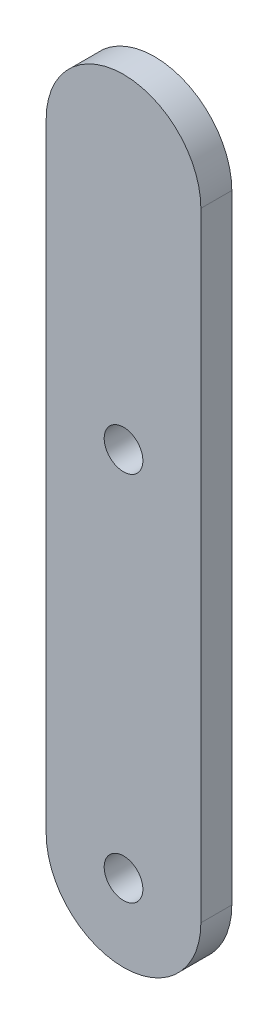
ISO-10303-21;
HEADER;
FILE_DESCRIPTION(('STEP AP214'),'2;1');
FILE_NAME('part.step','',(''),(''),'','','');
FILE_SCHEMA(('AUTOMOTIVE_DESIGN { 1 0 10303 214 1 1 1 1 }'));
ENDSEC;
DATA;
#1=APPLICATION_CONTEXT('core data for automotive mechanical design processes');
#2=APPLICATION_PROTOCOL_DEFINITION('international standard','automotive_design',2000,#1);
#3=PRODUCT_CONTEXT('',#1,'mechanical');
#4=PRODUCT('Part','Part','',(#3));
#5=PRODUCT_RELATED_PRODUCT_CATEGORY('part','',(#4));
#6=PRODUCT_DEFINITION_FORMATION('','',#4);
#7=PRODUCT_DEFINITION_CONTEXT('part definition',#1,'design');
#8=PRODUCT_DEFINITION('design','',#6,#7);
#9=PRODUCT_DEFINITION_SHAPE('','',#8);
#10=(LENGTH_UNIT() NAMED_UNIT(*) SI_UNIT(.MILLI.,.METRE.));
#11=(NAMED_UNIT(*) PLANE_ANGLE_UNIT() SI_UNIT($,.RADIAN.));
#12=(NAMED_UNIT(*) SI_UNIT($,.STERADIAN.) SOLID_ANGLE_UNIT());
#13=UNCERTAINTY_MEASURE_WITH_UNIT(LENGTH_MEASURE(1.E-05),#10,'distance_accuracy_value','');
#14=(GEOMETRIC_REPRESENTATION_CONTEXT(3) GLOBAL_UNCERTAINTY_ASSIGNED_CONTEXT((#13)) GLOBAL_UNIT_ASSIGNED_CONTEXT((#10,
#11,#12)) REPRESENTATION_CONTEXT('',''));
#15=CARTESIAN_POINT('',(0.,0.,0.));
#16=DIRECTION('',(0.,0.,1.));
#17=DIRECTION('',(1.,0.,0.));
#18=AXIS2_PLACEMENT_3D('',#15,#16,#17);
#19=CARTESIAN_POINT('',(0.,0.,2.));
#20=DIRECTION('',(0.,0.,1.));
#21=DIRECTION('',(1.,0.,0.));
#22=AXIS2_PLACEMENT_3D('',#19,#20,#21);
#23=PLANE('',#22);
#24=CARTESIAN_POINT('',(0.,0.,2.));
#25=DIRECTION('',(0.,0.,1.));
#26=DIRECTION('',(1.,0.,0.));
#27=AXIS2_PLACEMENT_3D('',#24,#25,#26);
#28=CIRCLE('',#27,1.25);
#29=CARTESIAN_POINT('',(1.25,0.,2.));
#30=VERTEX_POINT('',#29);
#31=EDGE_CURVE('E104',#30,#30,#28,.T.);
#32=ORIENTED_EDGE('',*,*,#31,.F.);
#33=EDGE_LOOP('',(#32));
#34=FACE_BOUND('',#33,.T.);
#35=CARTESIAN_POINT('',(0.,0.,2.));
#36=DIRECTION('',(0.,0.,1.));
#37=DIRECTION('',(1.,0.,0.));
#38=AXIS2_PLACEMENT_3D('',#35,#36,#37);
#39=CIRCLE('',#38,5.);
#40=CARTESIAN_POINT('',(-5.,0.,2.));
#41=VERTEX_POINT('',#40);
#42=CARTESIAN_POINT('',(5.,0.,2.));
#43=VERTEX_POINT('',#42);
#44=EDGE_CURVE('E89',#41,#43,#39,.T.);
#45=ORIENTED_EDGE('',*,*,#44,.T.);
#46=DIRECTION('',(0.,1.,0.));
#47=VECTOR('',#46,1.);
#48=CARTESIAN_POINT('',(5.,0.,2.));
#49=LINE('',#48,#47);
#50=CARTESIAN_POINT('',(5.,40.,2.));
#51=VERTEX_POINT('',#50);
#52=EDGE_CURVE('E84',#43,#51,#49,.T.);
#53=ORIENTED_EDGE('',*,*,#52,.T.);
#54=CARTESIAN_POINT('',(0.,40.,2.));
#55=DIRECTION('',(0.,0.,1.));
#56=DIRECTION('',(1.,0.,0.));
#57=AXIS2_PLACEMENT_3D('',#54,#55,#56);
#58=CIRCLE('',#57,5.);
#59=CARTESIAN_POINT('',(-5.,40.,2.));
#60=VERTEX_POINT('',#59);
#61=EDGE_CURVE('E87',#51,#60,#58,.T.);
#62=ORIENTED_EDGE('',*,*,#61,.T.);
#63=DIRECTION('',(0.,-1.,0.));
#64=VECTOR('',#63,1.);
#65=CARTESIAN_POINT('',(-5.,0.,2.));
#66=LINE('',#65,#64);
#67=EDGE_CURVE('E54',#60,#41,#66,.T.);
#68=ORIENTED_EDGE('',*,*,#67,.T.);
#69=EDGE_LOOP('',(#45,#53,#62,#68));
#70=FACE_BOUND('',#69,.T.);
#71=CARTESIAN_POINT('',(0.,24.,2.));
#72=DIRECTION('',(0.,0.,1.));
#73=DIRECTION('',(1.,0.,0.));
#74=AXIS2_PLACEMENT_3D('',#71,#72,#73);
#75=CIRCLE('',#74,1.25);
#76=CARTESIAN_POINT('',(1.25,24.,2.));
#77=VERTEX_POINT('',#76);
#78=EDGE_CURVE('E119',#77,#77,#75,.T.);
#79=ORIENTED_EDGE('',*,*,#78,.F.);
#80=EDGE_LOOP('',(#79));
#81=FACE_BOUND('',#80,.T.);
#82=ADVANCED_FACE('F37',(#34,#70,#81),#23,.T.);
#83=CARTESIAN_POINT('',(0.,0.,0.));
#84=DIRECTION('',(0.,0.,1.));
#85=DIRECTION('',(1.,0.,0.));
#86=AXIS2_PLACEMENT_3D('',#83,#84,#85);
#87=PLANE('',#86);
#88=CARTESIAN_POINT('',(0.,0.,0.));
#89=DIRECTION('',(0.,0.,1.));
#90=DIRECTION('',(1.,0.,0.));
#91=AXIS2_PLACEMENT_3D('',#88,#89,#90);
#92=CIRCLE('',#91,5.);
#93=CARTESIAN_POINT('',(-5.,0.,0.));
#94=VERTEX_POINT('',#93);
#95=CARTESIAN_POINT('',(5.,0.,0.));
#96=VERTEX_POINT('',#95);
#97=EDGE_CURVE('E101',#94,#96,#92,.T.);
#98=ORIENTED_EDGE('',*,*,#97,.F.);
#99=DIRECTION('',(0.,-1.,0.));
#100=VECTOR('',#99,1.);
#101=CARTESIAN_POINT('',(-5.,0.,0.));
#102=LINE('',#101,#100);
#103=CARTESIAN_POINT('',(-5.,40.,0.));
#104=VERTEX_POINT('',#103);
#105=EDGE_CURVE('E77',#104,#94,#102,.T.);
#106=ORIENTED_EDGE('',*,*,#105,.F.);
#107=CARTESIAN_POINT('',(0.,40.,0.));
#108=DIRECTION('',(0.,0.,1.));
#109=DIRECTION('',(1.,0.,0.));
#110=AXIS2_PLACEMENT_3D('',#107,#108,#109);
#111=CIRCLE('',#110,5.);
#112=CARTESIAN_POINT('',(5.,40.,0.));
#113=VERTEX_POINT('',#112);
#114=EDGE_CURVE('E71',#113,#104,#111,.T.);
#115=ORIENTED_EDGE('',*,*,#114,.F.);
#116=DIRECTION('',(0.,1.,0.));
#117=VECTOR('',#116,1.);
#118=CARTESIAN_POINT('',(5.,0.,0.));
#119=LINE('',#118,#117);
#120=EDGE_CURVE('E93',#96,#113,#119,.T.);
#121=ORIENTED_EDGE('',*,*,#120,.F.);
#122=EDGE_LOOP('',(#98,#106,#115,#121));
#123=FACE_BOUND('',#122,.T.);
#124=CARTESIAN_POINT('',(0.,0.,0.));
#125=DIRECTION('',(0.,0.,1.));
#126=DIRECTION('',(1.,0.,0.));
#127=AXIS2_PLACEMENT_3D('',#124,#125,#126);
#128=CIRCLE('',#127,1.25);
#129=CARTESIAN_POINT('',(1.25,0.,0.));
#130=VERTEX_POINT('',#129);
#131=EDGE_CURVE('E116',#130,#130,#128,.T.);
#132=ORIENTED_EDGE('',*,*,#131,.T.);
#133=EDGE_LOOP('',(#132));
#134=FACE_BOUND('',#133,.T.);
#135=CARTESIAN_POINT('',(0.,24.,0.));
#136=DIRECTION('',(0.,0.,1.));
#137=DIRECTION('',(1.,0.,0.));
#138=AXIS2_PLACEMENT_3D('',#135,#136,#137);
#139=CIRCLE('',#138,1.25);
#140=CARTESIAN_POINT('',(1.25,24.,0.));
#141=VERTEX_POINT('',#140);
#142=EDGE_CURVE('E122',#141,#141,#139,.T.);
#143=ORIENTED_EDGE('',*,*,#142,.T.);
#144=EDGE_LOOP('',(#143));
#145=FACE_BOUND('',#144,.T.);
#146=ADVANCED_FACE('F112',(#123,#134,#145),#87,.F.);
#147=CARTESIAN_POINT('',(0.,0.,2.));
#148=DIRECTION('',(0.,0.,-1.));
#149=DIRECTION('',(-1.,0.,0.));
#150=AXIS2_PLACEMENT_3D('',#147,#148,#149);
#151=CYLINDRICAL_SURFACE('',#150,5.);
#152=ORIENTED_EDGE('',*,*,#97,.T.);
#153=DIRECTION('',(0.,0.,-1.));
#154=VECTOR('',#153,1.);
#155=CARTESIAN_POINT('',(5.,0.,2.));
#156=LINE('',#155,#154);
#157=EDGE_CURVE('E11',#43,#96,#156,.T.);
#158=ORIENTED_EDGE('',*,*,#157,.F.);
#159=ORIENTED_EDGE('',*,*,#44,.F.);
#160=DIRECTION('',(0.,0.,-1.));
#161=VECTOR('',#160,1.);
#162=CARTESIAN_POINT('',(-5.,0.,2.));
#163=LINE('',#162,#161);
#164=EDGE_CURVE('E97',#41,#94,#163,.T.);
#165=ORIENTED_EDGE('',*,*,#164,.T.);
#166=EDGE_LOOP('',(#152,#158,#159,#165));
#167=FACE_BOUND('',#166,.T.);
#168=ADVANCED_FACE('F39',(#167),#151,.T.);
#169=CARTESIAN_POINT('',(5.,0.,2.));
#170=DIRECTION('',(-1.,0.,0.));
#171=DIRECTION('',(0.,0.,1.));
#172=AXIS2_PLACEMENT_3D('',#169,#170,#171);
#173=PLANE('',#172);
#174=ORIENTED_EDGE('',*,*,#120,.T.);
#175=DIRECTION('',(0.,0.,-1.));
#176=VECTOR('',#175,1.);
#177=CARTESIAN_POINT('',(5.,40.,2.));
#178=LINE('',#177,#176);
#179=EDGE_CURVE('E46',#51,#113,#178,.T.);
#180=ORIENTED_EDGE('',*,*,#179,.F.);
#181=ORIENTED_EDGE('',*,*,#52,.F.);
#182=ORIENTED_EDGE('',*,*,#157,.T.);
#183=EDGE_LOOP('',(#174,#180,#181,#182));
#184=FACE_BOUND('',#183,.T.);
#185=ADVANCED_FACE('F92',(#184),#173,.F.);
#186=CARTESIAN_POINT('',(0.,40.,2.));
#187=DIRECTION('',(0.,0.,-1.));
#188=DIRECTION('',(-1.,0.,0.));
#189=AXIS2_PLACEMENT_3D('',#186,#187,#188);
#190=CYLINDRICAL_SURFACE('',#189,5.);
#191=ORIENTED_EDGE('',*,*,#114,.T.);
#192=DIRECTION('',(0.,0.,-1.));
#193=VECTOR('',#192,1.);
#194=CARTESIAN_POINT('',(-5.,40.,2.));
#195=LINE('',#194,#193);
#196=EDGE_CURVE('E94',#60,#104,#195,.T.);
#197=ORIENTED_EDGE('',*,*,#196,.F.);
#198=ORIENTED_EDGE('',*,*,#61,.F.);
#199=ORIENTED_EDGE('',*,*,#179,.T.);
#200=EDGE_LOOP('',(#191,#197,#198,#199));
#201=FACE_BOUND('',#200,.T.);
#202=ADVANCED_FACE('F95',(#201),#190,.T.);
#203=CARTESIAN_POINT('',(-5.,0.,2.));
#204=DIRECTION('',(1.,0.,0.));
#205=DIRECTION('',(0.,0.,-1.));
#206=AXIS2_PLACEMENT_3D('',#203,#204,#205);
#207=PLANE('',#206);
#208=ORIENTED_EDGE('',*,*,#105,.T.);
#209=ORIENTED_EDGE('',*,*,#164,.F.);
#210=ORIENTED_EDGE('',*,*,#67,.F.);
#211=ORIENTED_EDGE('',*,*,#196,.T.);
#212=EDGE_LOOP('',(#208,#209,#210,#211));
#213=FACE_BOUND('',#212,.T.);
#214=ADVANCED_FACE('F109',(#213),#207,.F.);
#215=CARTESIAN_POINT('',(0.,0.,2.));
#216=DIRECTION('',(0.,0.,-1.));
#217=DIRECTION('',(-1.,0.,0.));
#218=AXIS2_PLACEMENT_3D('',#215,#216,#217);
#219=CYLINDRICAL_SURFACE('',#218,1.25);
#220=ORIENTED_EDGE('',*,*,#31,.T.);
#221=EDGE_LOOP('',(#220));
#222=FACE_BOUND('',#221,.T.);
#223=ORIENTED_EDGE('',*,*,#131,.F.);
#224=EDGE_LOOP('',(#223));
#225=FACE_BOUND('',#224,.T.);
#226=ADVANCED_FACE('F139',(#222,#225),#219,.F.);
#227=CARTESIAN_POINT('',(0.,24.,2.));
#228=DIRECTION('',(0.,0.,-1.));
#229=DIRECTION('',(-1.,0.,0.));
#230=AXIS2_PLACEMENT_3D('',#227,#228,#229);
#231=CYLINDRICAL_SURFACE('',#230,1.25);
#232=ORIENTED_EDGE('',*,*,#78,.T.);
#233=EDGE_LOOP('',(#232));
#234=FACE_BOUND('',#233,.T.);
#235=ORIENTED_EDGE('',*,*,#142,.F.);
#236=EDGE_LOOP('',(#235));
#237=FACE_BOUND('',#236,.T.);
#238=ADVANCED_FACE('F128',(#234,#237),#231,.F.);
#239=CLOSED_SHELL('',(#82,#146,#168,#185,#202,#214,#226,#238));
#240=MANIFOLD_SOLID_BREP('B2',#239);
#241=ADVANCED_BREP_SHAPE_REPRESENTATION('',(#18,#240),#14);
#242=SHAPE_DEFINITION_REPRESENTATION(#9,#241);
ENDSEC;
END-ISO-10303-21;
